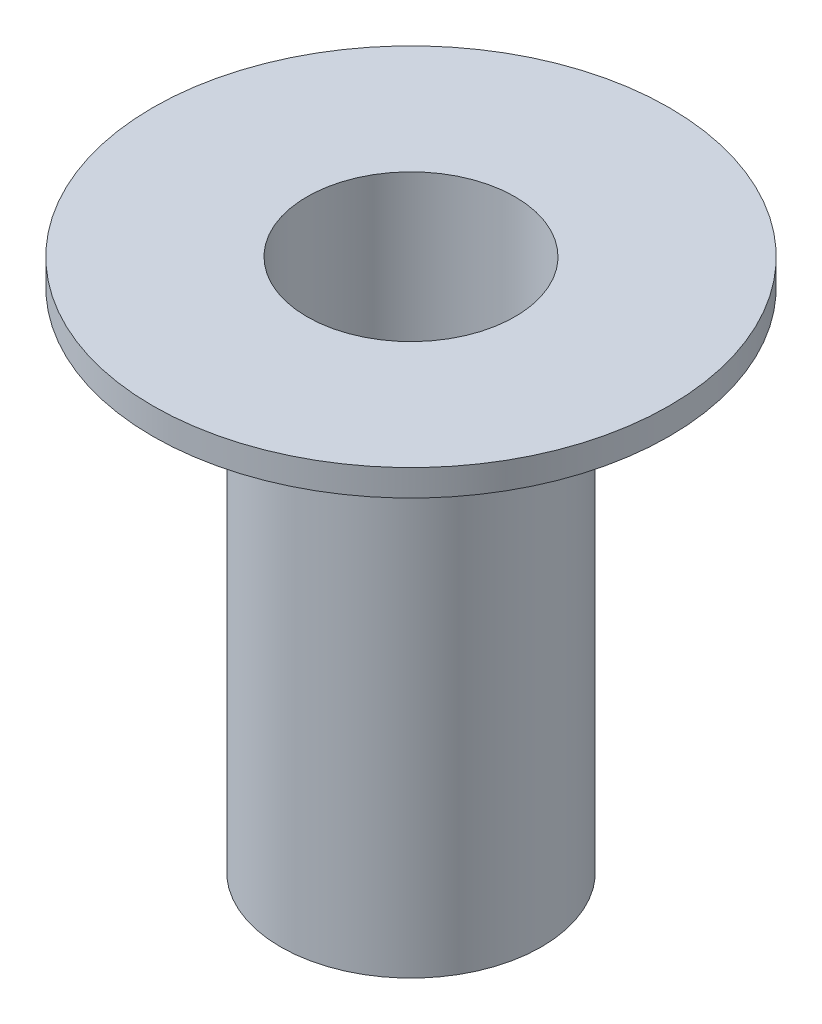
ISO-10303-21;
HEADER;
FILE_DESCRIPTION(('STEP AP214'),'2;1');
FILE_NAME('part.step','',(''),(''),'','','');
FILE_SCHEMA(('AUTOMOTIVE_DESIGN { 1 0 10303 214 1 1 1 1 }'));
ENDSEC;
DATA;
#1=APPLICATION_CONTEXT('core data for automotive mechanical design processes');
#2=APPLICATION_PROTOCOL_DEFINITION('international standard','automotive_design',2000,#1);
#3=PRODUCT_CONTEXT('',#1,'mechanical');
#4=PRODUCT('Part','Part','',(#3));
#5=PRODUCT_RELATED_PRODUCT_CATEGORY('part','',(#4));
#6=PRODUCT_DEFINITION_FORMATION('','',#4);
#7=PRODUCT_DEFINITION_CONTEXT('part definition',#1,'design');
#8=PRODUCT_DEFINITION('design','',#6,#7);
#9=PRODUCT_DEFINITION_SHAPE('','',#8);
#10=(LENGTH_UNIT() NAMED_UNIT(*) SI_UNIT(.MILLI.,.METRE.));
#11=(NAMED_UNIT(*) PLANE_ANGLE_UNIT() SI_UNIT($,.RADIAN.));
#12=(NAMED_UNIT(*) SI_UNIT($,.STERADIAN.) SOLID_ANGLE_UNIT());
#13=UNCERTAINTY_MEASURE_WITH_UNIT(LENGTH_MEASURE(1.E-05),#10,'distance_accuracy_value','');
#14=(GEOMETRIC_REPRESENTATION_CONTEXT(3) GLOBAL_UNCERTAINTY_ASSIGNED_CONTEXT((#13)) GLOBAL_UNIT_ASSIGNED_CONTEXT((#10,
#11,#12)) REPRESENTATION_CONTEXT('',''));
#15=CARTESIAN_POINT('',(0.,0.,0.));
#16=DIRECTION('',(0.,0.,1.));
#17=DIRECTION('',(1.,0.,0.));
#18=AXIS2_PLACEMENT_3D('',#15,#16,#17);
#19=CARTESIAN_POINT('',(0.,0.,0.));
#20=DIRECTION('',(0.,1.,0.));
#21=DIRECTION('',(0.,0.,1.));
#22=AXIS2_PLACEMENT_3D('',#19,#20,#21);
#23=PLANE('',#22);
#24=CARTESIAN_POINT('',(0.,0.,0.));
#25=DIRECTION('',(0.,1.,0.));
#26=DIRECTION('',(0.,0.,1.));
#27=AXIS2_PLACEMENT_3D('',#24,#25,#26);
#28=CIRCLE('',#27,1.881);
#29=CARTESIAN_POINT('',(0.,0.,1.881));
#30=VERTEX_POINT('',#29);
#31=EDGE_CURVE('E34',#30,#30,#28,.T.);
#32=ORIENTED_EDGE('',*,*,#31,.F.);
#33=EDGE_LOOP('',(#32));
#34=FACE_BOUND('',#33,.T.);
#35=CARTESIAN_POINT('',(0.,0.,0.));
#36=DIRECTION('',(0.,1.,0.));
#37=DIRECTION('',(0.,0.,1.));
#38=AXIS2_PLACEMENT_3D('',#35,#36,#37);
#39=CIRCLE('',#38,1.5);
#40=CARTESIAN_POINT('',(0.,0.,1.5));
#41=VERTEX_POINT('',#40);
#42=EDGE_CURVE('E41',#41,#41,#39,.T.);
#43=ORIENTED_EDGE('',*,*,#42,.T.);
#44=EDGE_LOOP('',(#43));
#45=FACE_BOUND('',#44,.T.);
#46=ADVANCED_FACE('F30',(#34,#45),#23,.F.);
#47=CARTESIAN_POINT('',(0.,7.3,0.));
#48=DIRECTION('',(0.,-1.,0.));
#49=DIRECTION('',(0.,0.,-1.));
#50=AXIS2_PLACEMENT_3D('',#47,#48,#49);
#51=CYLINDRICAL_SURFACE('',#50,1.881);
#52=CARTESIAN_POINT('',(0.,7.3,0.));
#53=DIRECTION('',(0.,1.,0.));
#54=DIRECTION('',(0.,0.,1.));
#55=AXIS2_PLACEMENT_3D('',#52,#53,#54);
#56=CIRCLE('',#55,1.881);
#57=CARTESIAN_POINT('',(0.,7.3,1.881));
#58=VERTEX_POINT('',#57);
#59=EDGE_CURVE('E10',#58,#58,#56,.T.);
#60=ORIENTED_EDGE('',*,*,#59,.F.);
#61=EDGE_LOOP('',(#60));
#62=FACE_BOUND('',#61,.T.);
#63=ORIENTED_EDGE('',*,*,#31,.T.);
#64=EDGE_LOOP('',(#63));
#65=FACE_BOUND('',#64,.T.);
#66=ADVANCED_FACE('F32',(#62,#65),#51,.T.);
#67=CARTESIAN_POINT('',(0.,7.3,0.));
#68=DIRECTION('',(0.,-1.,0.));
#69=DIRECTION('',(0.,0.,-1.));
#70=AXIS2_PLACEMENT_3D('',#67,#68,#69);
#71=CYLINDRICAL_SURFACE('',#70,1.5);
#72=ORIENTED_EDGE('',*,*,#42,.F.);
#73=EDGE_LOOP('',(#72));
#74=FACE_BOUND('',#73,.T.);
#75=CARTESIAN_POINT('',(0.,7.681,0.));
#76=DIRECTION('',(0.,1.,0.));
#77=DIRECTION('',(0.,0.,1.));
#78=AXIS2_PLACEMENT_3D('',#75,#76,#77);
#79=CIRCLE('',#78,1.5);
#80=CARTESIAN_POINT('',(0.,7.681,1.5));
#81=VERTEX_POINT('',#80);
#82=EDGE_CURVE('E49',#81,#81,#79,.T.);
#83=ORIENTED_EDGE('',*,*,#82,.T.);
#84=EDGE_LOOP('',(#83));
#85=FACE_BOUND('',#84,.T.);
#86=ADVANCED_FACE('F55',(#74,#85),#71,.F.);
#87=CARTESIAN_POINT('',(0.,7.3,0.));
#88=DIRECTION('',(0.,1.,0.));
#89=DIRECTION('',(0.,0.,1.));
#90=AXIS2_PLACEMENT_3D('',#87,#88,#89);
#91=PLANE('',#90);
#92=CARTESIAN_POINT('',(0.,7.3,0.));
#93=DIRECTION('',(0.,1.,0.));
#94=DIRECTION('',(0.,0.,1.));
#95=AXIS2_PLACEMENT_3D('',#92,#93,#94);
#96=CIRCLE('',#95,3.725);
#97=CARTESIAN_POINT('',(0.,7.3,-3.725));
#98=VERTEX_POINT('',#97);
#99=EDGE_CURVE('E46',#98,#98,#96,.T.);
#100=ORIENTED_EDGE('',*,*,#99,.F.);
#101=EDGE_LOOP('',(#100));
#102=FACE_BOUND('',#101,.T.);
#103=ORIENTED_EDGE('',*,*,#59,.T.);
#104=EDGE_LOOP('',(#103));
#105=FACE_BOUND('',#104,.T.);
#106=ADVANCED_FACE('F60',(#102,#105),#91,.F.);
#107=CARTESIAN_POINT('',(0.,7.681,0.));
#108=DIRECTION('',(0.,1.,0.));
#109=DIRECTION('',(0.,0.,1.));
#110=AXIS2_PLACEMENT_3D('',#107,#108,#109);
#111=PLANE('',#110);
#112=CARTESIAN_POINT('',(0.,7.681,0.));
#113=DIRECTION('',(0.,1.,0.));
#114=DIRECTION('',(0.,0.,1.));
#115=AXIS2_PLACEMENT_3D('',#112,#113,#114);
#116=CIRCLE('',#115,3.725);
#117=CARTESIAN_POINT('',(0.,7.681,-3.725));
#118=VERTEX_POINT('',#117);
#119=EDGE_CURVE('E45',#118,#118,#116,.T.);
#120=ORIENTED_EDGE('',*,*,#119,.T.);
#121=EDGE_LOOP('',(#120));
#122=FACE_BOUND('',#121,.T.);
#123=ORIENTED_EDGE('',*,*,#82,.F.);
#124=EDGE_LOOP('',(#123));
#125=FACE_BOUND('',#124,.T.);
#126=ADVANCED_FACE('F57',(#122,#125),#111,.T.);
#127=CARTESIAN_POINT('',(0.,7.681,0.));
#128=DIRECTION('',(0.,-1.,0.));
#129=DIRECTION('',(0.,0.,-1.));
#130=AXIS2_PLACEMENT_3D('',#127,#128,#129);
#131=CYLINDRICAL_SURFACE('',#130,3.725);
#132=CARTESIAN_POINT('',(0.,7.681,-3.725));
#133=CARTESIAN_POINT('',(0.,7.67703125,-3.725));
#134=CARTESIAN_POINT('',(0.,7.6730625,-3.725));
#135=CARTESIAN_POINT('',(0.,7.665125,-3.725));
#136=CARTESIAN_POINT('',(0.,7.66115625,-3.725));
#137=CARTESIAN_POINT('',(0.,7.65321875,-3.725));
#138=CARTESIAN_POINT('',(0.,7.64925,-3.725));
#139=CARTESIAN_POINT('',(0.,7.6413125,-3.725));
#140=CARTESIAN_POINT('',(0.,7.63734375,-3.725));
#141=CARTESIAN_POINT('',(0.,7.62940625,-3.725));
#142=CARTESIAN_POINT('',(0.,7.6254375,-3.725));
#143=CARTESIAN_POINT('',(0.,7.6175,-3.725));
#144=CARTESIAN_POINT('',(0.,7.61353125,-3.725));
#145=CARTESIAN_POINT('',(0.,7.60559375,-3.725));
#146=CARTESIAN_POINT('',(0.,7.601625,-3.725));
#147=CARTESIAN_POINT('',(0.,7.5936875,-3.725));
#148=CARTESIAN_POINT('',(0.,7.58971875,-3.725));
#149=CARTESIAN_POINT('',(0.,7.58178125,-3.725));
#150=CARTESIAN_POINT('',(0.,7.5778125,-3.725));
#151=CARTESIAN_POINT('',(0.,7.569875,-3.725));
#152=CARTESIAN_POINT('',(0.,7.56590625,-3.725));
#153=CARTESIAN_POINT('',(0.,7.55796875,-3.725));
#154=CARTESIAN_POINT('',(0.,7.554,-3.725));
#155=CARTESIAN_POINT('',(0.,7.5460625,-3.725));
#156=CARTESIAN_POINT('',(0.,7.54209375,-3.725));
#157=CARTESIAN_POINT('',(0.,7.53415625,-3.725));
#158=CARTESIAN_POINT('',(0.,7.5301875,-3.725));
#159=CARTESIAN_POINT('',(0.,7.52225,-3.725));
#160=CARTESIAN_POINT('',(0.,7.51828125,-3.725));
#161=CARTESIAN_POINT('',(0.,7.51034375,-3.725));
#162=CARTESIAN_POINT('',(0.,7.506375,-3.725));
#163=CARTESIAN_POINT('',(0.,7.4984375,-3.725));
#164=CARTESIAN_POINT('',(0.,7.49446875,-3.725));
#165=CARTESIAN_POINT('',(0.,7.48653125,-3.725));
#166=CARTESIAN_POINT('',(0.,7.4825625,-3.725));
#167=CARTESIAN_POINT('',(0.,7.474625,-3.725));
#168=CARTESIAN_POINT('',(0.,7.47065625,-3.725));
#169=CARTESIAN_POINT('',(0.,7.46271875,-3.725));
#170=CARTESIAN_POINT('',(0.,7.45875,-3.725));
#171=CARTESIAN_POINT('',(0.,7.4508125,-3.725));
#172=CARTESIAN_POINT('',(0.,7.44684375,-3.725));
#173=CARTESIAN_POINT('',(0.,7.43890625,-3.725));
#174=CARTESIAN_POINT('',(0.,7.4349375,-3.725));
#175=CARTESIAN_POINT('',(0.,7.427,-3.725));
#176=CARTESIAN_POINT('',(0.,7.42303125,-3.725));
#177=CARTESIAN_POINT('',(0.,7.41509375,-3.725));
#178=CARTESIAN_POINT('',(0.,7.411125,-3.725));
#179=CARTESIAN_POINT('',(0.,7.4031875,-3.725));
#180=CARTESIAN_POINT('',(0.,7.39921875,-3.725));
#181=CARTESIAN_POINT('',(0.,7.39128125,-3.725));
#182=CARTESIAN_POINT('',(0.,7.3873125,-3.725));
#183=CARTESIAN_POINT('',(0.,7.379375,-3.725));
#184=CARTESIAN_POINT('',(0.,7.37540625,-3.725));
#185=CARTESIAN_POINT('',(0.,7.36746875,-3.725));
#186=CARTESIAN_POINT('',(0.,7.3635,-3.725));
#187=CARTESIAN_POINT('',(0.,7.3555625,-3.725));
#188=CARTESIAN_POINT('',(0.,7.35159375,-3.725));
#189=CARTESIAN_POINT('',(0.,7.34365625,-3.725));
#190=CARTESIAN_POINT('',(0.,7.3396875,-3.725));
#191=CARTESIAN_POINT('',(0.,7.33175,-3.725));
#192=CARTESIAN_POINT('',(0.,7.32778125,-3.725));
#193=CARTESIAN_POINT('',(0.,7.31984375,-3.725));
#194=CARTESIAN_POINT('',(0.,7.315875,-3.725));
#195=CARTESIAN_POINT('',(0.,7.3079375,-3.725));
#196=CARTESIAN_POINT('',(0.,7.30396875,-3.725));
#197=CARTESIAN_POINT('',(0.,7.3,-3.725));
#198=B_SPLINE_CURVE_WITH_KNOTS('',3,(#132,#133,#134,#135,#136,#137,#138,#139,#140,#141,#142,
#143,#144,#145,#146,#147,#148,#149,#150,#151,#152,#153,#154,#155,#156,#157,#158,#159,#160,#161,
#162,#163,#164,#165,#166,#167,#168,#169,#170,#171,#172,#173,#174,#175,#176,#177,#178,#179,#180,
#181,#182,#183,#184,#185,#186,#187,#188,#189,#190,#191,#192,#193,#194,#195,#196,#197),
.UNSPECIFIED.,.F.,.F.,(4,2,2,2,2,2,2,2,2,2,2,2,2,2,2,2,2,2,2,2,2,2,2,2,2,2,2,2,2,2,2,2,4),(0.,
0.0119062500000006,0.0238125000000004,0.0357187500000002,0.0476250000000008,0.0595312500000006,
0.0714375000000003,0.0833437500000001,0.0952500000000007,0.10715625,0.1190625,0.130968750000001,
0.142875000000001,0.15478125,0.1666875,0.178593750000001,0.190500000000001,0.20240625,
0.214312500000001,0.226218750000001,0.238125,0.25003125,0.261937500000001,0.273843750000001,
0.28575,0.29765625,0.309562500000001,0.321468750000001,0.333375,0.345281250000001,
0.357187500000001,0.36909375,0.381),.UNSPECIFIED.);
#199=EDGE_CURVE('BSEAM59',#118,#98,#198,.T.);
#200=ORIENTED_EDGE('',*,*,#119,.F.);
#201=ORIENTED_EDGE('',*,*,#99,.T.);
#202=ORIENTED_EDGE('',*,*,#199,.T.);
#203=ORIENTED_EDGE('',*,*,#199,.F.);
#204=EDGE_LOOP('',(#200,#202,#201,#203));
#205=FACE_BOUND('',#204,.T.);
#206=ADVANCED_FACE('F59',(#205),#131,.T.);
#207=CLOSED_SHELL('',(#46,#66,#86,#106,#126,#206));
#208=MANIFOLD_SOLID_BREP('B2',#207);
#209=ADVANCED_BREP_SHAPE_REPRESENTATION('',(#18,#208),#14);
#210=SHAPE_DEFINITION_REPRESENTATION(#9,#209);
ENDSEC;
END-ISO-10303-21;
